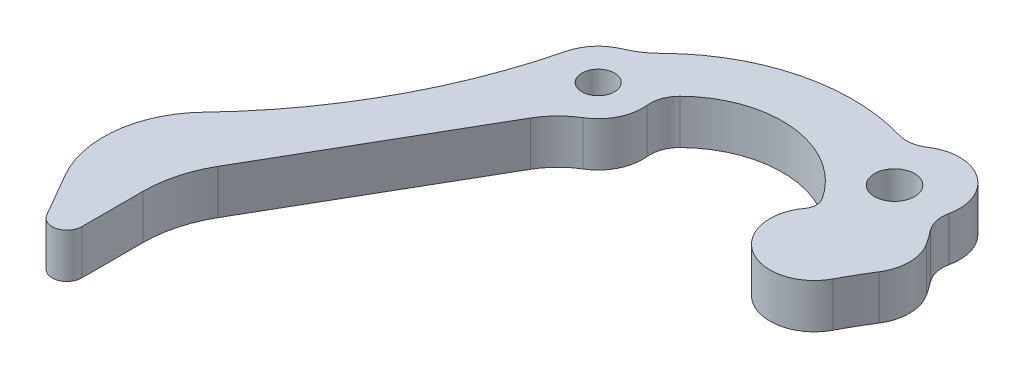
ISO-10303-21;
HEADER;
FILE_DESCRIPTION(('STEP AP214'),'2;1');
FILE_NAME('part.step','',(''),(''),'','','');
FILE_SCHEMA(('AUTOMOTIVE_DESIGN { 1 0 10303 214 1 1 1 1 }'));
ENDSEC;
DATA;
#1=APPLICATION_CONTEXT('core data for automotive mechanical design processes');
#2=APPLICATION_PROTOCOL_DEFINITION('international standard','automotive_design',2000,#1);
#3=PRODUCT_CONTEXT('',#1,'mechanical');
#4=PRODUCT('Part','Part','',(#3));
#5=PRODUCT_RELATED_PRODUCT_CATEGORY('part','',(#4));
#6=PRODUCT_DEFINITION_FORMATION('','',#4);
#7=PRODUCT_DEFINITION_CONTEXT('part definition',#1,'design');
#8=PRODUCT_DEFINITION('design','',#6,#7);
#9=PRODUCT_DEFINITION_SHAPE('','',#8);
#10=(LENGTH_UNIT() NAMED_UNIT(*) SI_UNIT(.MILLI.,.METRE.));
#11=(NAMED_UNIT(*) PLANE_ANGLE_UNIT() SI_UNIT($,.RADIAN.));
#12=(NAMED_UNIT(*) SI_UNIT($,.STERADIAN.) SOLID_ANGLE_UNIT());
#13=UNCERTAINTY_MEASURE_WITH_UNIT(LENGTH_MEASURE(1.E-05),#10,'distance_accuracy_value','');
#14=(GEOMETRIC_REPRESENTATION_CONTEXT(3) GLOBAL_UNCERTAINTY_ASSIGNED_CONTEXT((#13)) GLOBAL_UNIT_ASSIGNED_CONTEXT((#10,
#11,#12)) REPRESENTATION_CONTEXT('',''));
#15=CARTESIAN_POINT('',(0.,0.,0.));
#16=DIRECTION('',(0.,0.,1.));
#17=DIRECTION('',(1.,0.,0.));
#18=AXIS2_PLACEMENT_3D('',#15,#16,#17);
#19=CARTESIAN_POINT('',(9.58333333333333,3.,5.39997427977414));
#20=DIRECTION('',(0.,-1.,0.));
#21=DIRECTION('',(0.,0.,-1.));
#22=AXIS2_PLACEMENT_3D('',#19,#20,#21);
#23=CYLINDRICAL_SURFACE('',#22,13.);
#24=CARTESIAN_POINT('',(9.58333333333333,0.,5.39997427977414));
#25=DIRECTION('',(0.,1.,0.));
#26=DIRECTION('',(0.,0.,1.));
#27=AXIS2_PLACEMENT_3D('',#24,#25,#26);
#28=CIRCLE('',#27,13.);
#29=CARTESIAN_POINT('',(19.8692193431616,0.,-2.54990301442477));
#30=VERTEX_POINT('',#29);
#31=CARTESIAN_POINT('',(20.525,0.,-1.61999228393224));
#32=VERTEX_POINT('',#31);
#33=EDGE_CURVE('E281',#30,#32,#28,.F.);
#34=ORIENTED_EDGE('',*,*,#33,.F.);
#35=DIRECTION('',(0.,-1.,0.));
#36=VECTOR('',#35,1.);
#37=CARTESIAN_POINT('',(19.8692193431616,3.,-2.54990301442477));
#38=LINE('',#37,#36);
#39=CARTESIAN_POINT('',(19.8692193431616,3.,-2.54990301442477));
#40=VERTEX_POINT('',#39);
#41=EDGE_CURVE('E355',#30,#40,#38,.F.);
#42=ORIENTED_EDGE('',*,*,#41,.T.);
#43=CARTESIAN_POINT('',(9.58333333333333,3.,5.39997427977414));
#44=DIRECTION('',(0.,1.,0.));
#45=DIRECTION('',(0.,0.,1.));
#46=AXIS2_PLACEMENT_3D('',#43,#44,#45);
#47=CIRCLE('',#46,13.);
#48=CARTESIAN_POINT('',(20.525,3.,-1.61999228393224));
#49=VERTEX_POINT('',#48);
#50=EDGE_CURVE('E262',#40,#49,#47,.F.);
#51=ORIENTED_EDGE('',*,*,#50,.T.);
#52=DIRECTION('',(0.,-1.,0.));
#53=VECTOR('',#52,1.);
#54=CARTESIAN_POINT('',(20.525,3.,-1.61999228393224));
#55=LINE('',#54,#53);
#56=EDGE_CURVE('E266',#49,#32,#55,.T.);
#57=ORIENTED_EDGE('',*,*,#56,.T.);
#58=EDGE_LOOP('',(#34,#42,#51,#57));
#59=FACE_BOUND('',#58,.T.);
#60=ADVANCED_FACE('F41',(#59),#23,.T.);
#61=CARTESIAN_POINT('',(8.47222222222222,3.,3.03668414842308));
#62=DIRECTION('',(0.,-1.,0.));
#63=DIRECTION('',(0.,0.,-1.));
#64=AXIS2_PLACEMENT_3D('',#61,#62,#63);
#65=CYLINDRICAL_SURFACE('',#64,7.);
#66=CARTESIAN_POINT('',(8.47222222222222,0.,3.03668414842308));
#67=DIRECTION('',(0.,1.,0.));
#68=DIRECTION('',(0.,0.,1.));
#69=AXIS2_PLACEMENT_3D('',#66,#67,#68);
#70=CIRCLE('',#69,7.);
#71=CARTESIAN_POINT('',(3.57117994761107,0.,-1.96129390499756));
#72=VERTEX_POINT('',#71);
#73=CARTESIAN_POINT('',(14.3662242350737,0.,-0.739655385107008));
#74=VERTEX_POINT('',#73);
#75=EDGE_CURVE('E272',#72,#74,#70,.F.);
#76=ORIENTED_EDGE('',*,*,#75,.T.);
#77=DIRECTION('',(0.,-1.,0.));
#78=VECTOR('',#77,1.);
#79=CARTESIAN_POINT('',(14.3662242350737,3.,-0.739655385107009));
#80=LINE('',#79,#78);
#81=CARTESIAN_POINT('',(14.3662242350737,3.,-0.739655385107008));
#82=VERTEX_POINT('',#81);
#83=EDGE_CURVE('E297',#74,#82,#80,.F.);
#84=ORIENTED_EDGE('',*,*,#83,.T.);
#85=CARTESIAN_POINT('',(8.47222222222222,3.,3.03668414842308));
#86=DIRECTION('',(0.,1.,0.));
#87=DIRECTION('',(0.,0.,1.));
#88=AXIS2_PLACEMENT_3D('',#85,#86,#87);
#89=CIRCLE('',#88,7.);
#90=CARTESIAN_POINT('',(3.57117994761107,3.,-1.96129390499756));
#91=VERTEX_POINT('',#90);
#92=EDGE_CURVE('E253',#91,#82,#89,.F.);
#93=ORIENTED_EDGE('',*,*,#92,.F.);
#94=DIRECTION('',(0.,-1.,0.));
#95=VECTOR('',#94,1.);
#96=CARTESIAN_POINT('',(3.57117994761107,3.,-1.96129390499756));
#97=LINE('',#96,#95);
#98=EDGE_CURVE('E294',#91,#72,#97,.T.);
#99=ORIENTED_EDGE('',*,*,#98,.T.);
#100=EDGE_LOOP('',(#76,#84,#93,#99));
#101=FACE_BOUND('',#100,.T.);
#102=ADVANCED_FACE('F394',(#101),#65,.F.);
#103=CARTESIAN_POINT('',(16.75,3.,2.16506350946109));
#104=DIRECTION('',(0.,-1.,0.));
#105=DIRECTION('',(0.,0.,-1.));
#106=AXIS2_PLACEMENT_3D('',#103,#104,#105);
#107=CYLINDRICAL_SURFACE('',#106,3.);
#108=CARTESIAN_POINT('',(16.75,0.,2.16506350946109));
#109=DIRECTION('',(0.,1.,0.));
#110=DIRECTION('',(0.,0.,1.));
#111=AXIS2_PLACEMENT_3D('',#108,#109,#110);
#112=CIRCLE('',#111,3.);
#113=CARTESIAN_POINT('',(14.3306679606426,0.,0.391132145698955));
#114=VERTEX_POINT('',#113);
#115=CARTESIAN_POINT('',(19.4030298609084,0.,3.56557504355433));
#116=VERTEX_POINT('',#115);
#117=EDGE_CURVE('E275',#114,#116,#112,.T.);
#118=ORIENTED_EDGE('',*,*,#117,.T.);
#119=DIRECTION('',(0.,-1.,0.));
#120=VECTOR('',#119,1.);
#121=CARTESIAN_POINT('',(19.4030298609084,3.,3.56557504355433));
#122=LINE('',#121,#120);
#123=CARTESIAN_POINT('',(19.4030298609084,3.,3.56557504355433));
#124=VERTEX_POINT('',#123);
#125=EDGE_CURVE('E292',#116,#124,#122,.F.);
#126=ORIENTED_EDGE('',*,*,#125,.T.);
#127=CARTESIAN_POINT('',(16.75,3.,2.16506350946109));
#128=DIRECTION('',(0.,1.,0.));
#129=DIRECTION('',(0.,0.,1.));
#130=AXIS2_PLACEMENT_3D('',#127,#128,#129);
#131=CIRCLE('',#130,3.);
#132=CARTESIAN_POINT('',(14.3306679606426,3.,0.391132145698955));
#133=VERTEX_POINT('',#132);
#134=EDGE_CURVE('E256',#133,#124,#131,.T.);
#135=ORIENTED_EDGE('',*,*,#134,.F.);
#136=DIRECTION('',(0.,-1.,0.));
#137=VECTOR('',#136,1.);
#138=CARTESIAN_POINT('',(14.3306679606426,3.,0.391132145698955));
#139=LINE('',#138,#137);
#140=EDGE_CURVE('E289',#133,#114,#139,.T.);
#141=ORIENTED_EDGE('',*,*,#140,.T.);
#142=EDGE_LOOP('',(#118,#126,#135,#141));
#143=FACE_BOUND('',#142,.T.);
#144=ADVANCED_FACE('F385',(#143),#107,.T.);
#145=CARTESIAN_POINT('',(18.,3.,0.));
#146=DIRECTION('',(0.,-1.,0.));
#147=DIRECTION('',(0.,0.,-1.));
#148=AXIS2_PLACEMENT_3D('',#145,#146,#147);
#149=CYLINDRICAL_SURFACE('',#148,3.);
#150=CARTESIAN_POINT('',(18.,3.,0.));
#151=DIRECTION('',(0.,1.,0.));
#152=DIRECTION('',(0.,0.,1.));
#153=AXIS2_PLACEMENT_3D('',#150,#151,#152);
#154=CIRCLE('',#153,3.);
#155=CARTESIAN_POINT('',(20.5393934972721,3.,1.59733548949879));
#156=VERTEX_POINT('',#155);
#157=EDGE_CURVE('E259',#156,#49,#154,.T.);
#158=ORIENTED_EDGE('',*,*,#157,.F.);
#159=DIRECTION('',(0.,-1.,0.));
#160=VECTOR('',#159,1.);
#161=CARTESIAN_POINT('',(20.5393934972721,3.,1.59733548949879));
#162=LINE('',#161,#160);
#163=CARTESIAN_POINT('',(20.5393934972721,0.,1.59733548949879));
#164=VERTEX_POINT('',#163);
#165=EDGE_CURVE('E286',#156,#164,#162,.T.);
#166=ORIENTED_EDGE('',*,*,#165,.T.);
#167=CARTESIAN_POINT('',(18.,0.,0.));
#168=DIRECTION('',(0.,1.,0.));
#169=DIRECTION('',(0.,0.,1.));
#170=AXIS2_PLACEMENT_3D('',#167,#168,#169);
#171=CIRCLE('',#170,3.);
#172=EDGE_CURVE('E278',#164,#32,#171,.T.);
#173=ORIENTED_EDGE('',*,*,#172,.T.);
#174=ORIENTED_EDGE('',*,*,#56,.F.);
#175=EDGE_LOOP('',(#158,#166,#173,#174));
#176=FACE_BOUND('',#175,.T.);
#177=ADVANCED_FACE('F377',(#176),#149,.T.);
#178=CARTESIAN_POINT('',(0.,3.,0.));
#179=DIRECTION('',(0.,-1.,0.));
#180=DIRECTION('',(0.,0.,-1.));
#181=AXIS2_PLACEMENT_3D('',#178,#179,#180);
#182=CYLINDRICAL_SURFACE('',#181,1.1);
#183=CARTESIAN_POINT('',(0.,3.,0.));
#184=DIRECTION('',(0.,1.,0.));
#185=DIRECTION('',(0.,0.,1.));
#186=AXIS2_PLACEMENT_3D('',#183,#184,#185);
#187=CIRCLE('',#186,1.1);
#188=CARTESIAN_POINT('',(0.,3.,1.1));
#189=VERTEX_POINT('',#188);
#190=EDGE_CURVE('E249',#189,#189,#187,.T.);
#191=ORIENTED_EDGE('',*,*,#190,.T.);
#192=EDGE_LOOP('',(#191));
#193=FACE_BOUND('',#192,.T.);
#194=CARTESIAN_POINT('',(0.,0.,0.));
#195=DIRECTION('',(0.,1.,0.));
#196=DIRECTION('',(0.,0.,1.));
#197=AXIS2_PLACEMENT_3D('',#194,#195,#196);
#198=CIRCLE('',#197,1.1);
#199=CARTESIAN_POINT('',(0.,0.,1.1));
#200=VERTEX_POINT('',#199);
#201=EDGE_CURVE('E269',#200,#200,#198,.T.);
#202=ORIENTED_EDGE('',*,*,#201,.F.);
#203=EDGE_LOOP('',(#202));
#204=FACE_BOUND('',#203,.T.);
#205=ADVANCED_FACE('F472',(#193,#204),#182,.F.);
#206=CARTESIAN_POINT('',(16.,3.,-4.));
#207=DIRECTION('',(0.,-1.,0.));
#208=DIRECTION('',(0.,0.,-1.));
#209=AXIS2_PLACEMENT_3D('',#206,#207,#208);
#210=CYLINDRICAL_SURFACE('',#209,1.35);
#211=CARTESIAN_POINT('',(16.,3.,-4.));
#212=DIRECTION('',(0.,1.,0.));
#213=DIRECTION('',(0.,0.,1.));
#214=AXIS2_PLACEMENT_3D('',#211,#212,#213);
#215=CIRCLE('',#214,1.35);
#216=CARTESIAN_POINT('',(16.,3.,-2.65));
#217=VERTEX_POINT('',#216);
#218=EDGE_CURVE('E246',#217,#217,#215,.T.);
#219=ORIENTED_EDGE('',*,*,#218,.T.);
#220=EDGE_LOOP('',(#219));
#221=FACE_BOUND('',#220,.T.);
#222=CARTESIAN_POINT('',(16.,0.,-4.));
#223=DIRECTION('',(0.,1.,0.));
#224=DIRECTION('',(0.,0.,1.));
#225=AXIS2_PLACEMENT_3D('',#222,#223,#224);
#226=CIRCLE('',#225,1.35);
#227=CARTESIAN_POINT('',(16.,0.,-2.65));
#228=VERTEX_POINT('',#227);
#229=EDGE_CURVE('E244',#228,#228,#226,.T.);
#230=ORIENTED_EDGE('',*,*,#229,.F.);
#231=EDGE_LOOP('',(#230));
#232=FACE_BOUND('',#231,.T.);
#233=ADVANCED_FACE('F466',(#221,#232),#210,.F.);
#234=CARTESIAN_POINT('',(0.426397690147714,3.,-3.82773018160502));
#235=VERTEX_POINT('',#234);
#236=CARTESIAN_POINT('',(13.2400714875913,3.,-7.07513157433364));
#237=VERTEX_POINT('',#236);
#238=EDGE_CURVE('E263',#235,#237,#47,.F.);
#239=ORIENTED_EDGE('',*,*,#238,.T.);
#240=DIRECTION('',(0.,-1.,0.));
#241=VECTOR('',#240,1.);
#242=CARTESIAN_POINT('',(13.2400714875913,3.,-7.07513157433364));
#243=LINE('',#242,#241);
#244=CARTESIAN_POINT('',(13.2400714875913,0.,-7.07513157433364));
#245=VERTEX_POINT('',#244);
#246=EDGE_CURVE('E353',#237,#245,#243,.T.);
#247=ORIENTED_EDGE('',*,*,#246,.T.);
#248=CARTESIAN_POINT('',(0.426397690147714,0.,-3.82773018160502));
#249=VERTEX_POINT('',#248);
#250=EDGE_CURVE('E250',#249,#245,#28,.F.);
#251=ORIENTED_EDGE('',*,*,#250,.F.);
#252=DIRECTION('',(0.,-1.,0.));
#253=VECTOR('',#252,1.);
#254=CARTESIAN_POINT('',(0.426397690147712,3.,-3.82773018160502));
#255=LINE('',#254,#253);
#256=EDGE_CURVE('E307',#249,#235,#255,.F.);
#257=ORIENTED_EDGE('',*,*,#256,.T.);
#258=EDGE_LOOP('',(#239,#247,#251,#257));
#259=FACE_BOUND('',#258,.T.);
#260=ADVANCED_FACE('F441',(#259),#23,.T.);
#261=CARTESIAN_POINT('',(0.,3.,0.));
#262=DIRECTION('',(0.,1.,0.));
#263=DIRECTION('',(0.,0.,1.));
#264=AXIS2_PLACEMENT_3D('',#261,#262,#263);
#265=PLANE('',#264);
#266=DIRECTION('',(0.499999999999994,0.,0.866025403784442));
#267=VECTOR('',#266,1.);
#268=CARTESIAN_POINT('',(-12.5788030628724,3.,23.3897885329419));
#269=LINE('',#268,#267);
#270=CARTESIAN_POINT('',(-12.5788030628724,3.,23.3897885329419));
#271=VERTEX_POINT('',#270);
#272=CARTESIAN_POINT('',(-10.8660254037846,3.,26.356406460551));
#273=VERTEX_POINT('',#272);
#274=EDGE_CURVE('E238',#271,#273,#269,.T.);
#275=ORIENTED_EDGE('',*,*,#274,.T.);
#276=CARTESIAN_POINT('',(-10.0000000000001,3.,25.856406460551));
#277=DIRECTION('',(0.,1.,0.));
#278=DIRECTION('',(0.,0.,1.));
#279=AXIS2_PLACEMENT_3D('',#276,#277,#278);
#280=CIRCLE('',#279,1.);
#281=CARTESIAN_POINT('',(-9.00000000000011,3.,25.856406460551));
#282=VERTEX_POINT('',#281);
#283=EDGE_CURVE('E333',#273,#282,#280,.T.);
#284=ORIENTED_EDGE('',*,*,#283,.T.);
#285=DIRECTION('',(0.,0.,-1.));
#286=VECTOR('',#285,1.);
#287=CARTESIAN_POINT('',(-9.00000000000011,3.,29.5884572681199));
#288=LINE('',#287,#286);
#289=CARTESIAN_POINT('',(-9.00000000000011,3.,21.7320508075689));
#290=VERTEX_POINT('',#289);
#291=EDGE_CURVE('E225',#282,#290,#288,.T.);
#292=ORIENTED_EDGE('',*,*,#291,.T.);
#293=CARTESIAN_POINT('',(-1.00000000000011,3.,21.7320508075689));
#294=DIRECTION('',(0.,1.,0.));
#295=DIRECTION('',(0.,0.,1.));
#296=AXIS2_PLACEMENT_3D('',#293,#294,#295);
#297=CIRCLE('',#296,8.);
#298=CARTESIAN_POINT('',(-7.9282032302756,3.,17.7320508075689));
#299=VERTEX_POINT('',#298);
#300=EDGE_CURVE('E344',#290,#299,#297,.F.);
#301=ORIENTED_EDGE('',*,*,#300,.T.);
#302=DIRECTION('',(0.500000000000004,0.,-0.866025403784436));
#303=VECTOR('',#302,1.);
#304=CARTESIAN_POINT('',(0.614016818818969,3.,2.93649167310371));
#305=LINE('',#304,#303);
#306=CARTESIAN_POINT('',(-0.204440865534852,3.,4.35410196624969));
#307=VERTEX_POINT('',#306);
#308=EDGE_CURVE('E228',#299,#307,#305,.T.);
#309=ORIENTED_EDGE('',*,*,#308,.T.);
#310=CARTESIAN_POINT('',(4.12568615338733,3.,6.8541019662497));
#311=DIRECTION('',(0.,1.,0.));
#312=DIRECTION('',(0.,0.,1.));
#313=AXIS2_PLACEMENT_3D('',#310,#311,#312);
#314=CIRCLE('',#313,5.);
#315=CARTESIAN_POINT('',(1.54713230752025,3.,2.57028823734364));
#316=VERTEX_POINT('',#315);
#317=EDGE_CURVE('E321',#307,#316,#314,.F.);
#318=ORIENTED_EDGE('',*,*,#317,.T.);
#319=CARTESIAN_POINT('',(0.,3.,0.));
#320=DIRECTION('',(0.,1.,0.));
#321=DIRECTION('',(0.,0.,1.));
#322=AXIS2_PLACEMENT_3D('',#319,#320,#321);
#323=CIRCLE('',#322,3.);
#324=CARTESIAN_POINT('',(2.98288664421427,3.,-0.319980105269283));
#325=VERTEX_POINT('',#324);
#326=EDGE_CURVE('E233',#316,#325,#323,.T.);
#327=ORIENTED_EDGE('',*,*,#326,.T.);
#328=CARTESIAN_POINT('',(4.97147774035711,3.,-0.533300175448805));
#329=DIRECTION('',(0.,1.,0.));
#330=DIRECTION('',(0.,0.,1.));
#331=AXIS2_PLACEMENT_3D('',#328,#329,#330);
#332=CIRCLE('',#331,2.);
#333=EDGE_CURVE('E319',#325,#91,#332,.F.);
#334=ORIENTED_EDGE('',*,*,#333,.T.);
#335=ORIENTED_EDGE('',*,*,#92,.T.);
#336=CARTESIAN_POINT('',(13.5242239475235,3.,-0.200178308888424));
#337=DIRECTION('',(0.,1.,0.));
#338=DIRECTION('',(0.,0.,1.));
#339=AXIS2_PLACEMENT_3D('',#336,#337,#338);
#340=CIRCLE('',#339,1.);
#341=EDGE_CURVE('E315',#82,#133,#340,.F.);
#342=ORIENTED_EDGE('',*,*,#341,.T.);
#343=ORIENTED_EDGE('',*,*,#134,.T.);
#344=CARTESIAN_POINT('',(45.9333284699927,3.,17.5706903844867));
#345=DIRECTION('',(0.,1.,0.));
#346=DIRECTION('',(0.,0.,1.));
#347=AXIS2_PLACEMENT_3D('',#344,#345,#346);
#348=CIRCLE('',#347,30.);
#349=EDGE_CURVE('E311',#124,#156,#348,.F.);
#350=ORIENTED_EDGE('',*,*,#349,.T.);
#351=ORIENTED_EDGE('',*,*,#157,.T.);
#352=ORIENTED_EDGE('',*,*,#50,.F.);
#353=CARTESIAN_POINT('',(21.4516633446736,3.,-3.77296105968614));
#354=DIRECTION('',(0.,1.,0.));
#355=DIRECTION('',(0.,0.,1.));
#356=AXIS2_PLACEMENT_3D('',#353,#354,#355);
#357=CIRCLE('',#356,2.);
#358=CARTESIAN_POINT('',(19.4965148816765,3.,-4.1941433095968));
#359=VERTEX_POINT('',#358);
#360=EDGE_CURVE('E49',#40,#359,#357,.F.);
#361=ORIENTED_EDGE('',*,*,#360,.T.);
#362=CARTESIAN_POINT('',(16.5637921871807,3.,-4.82591668446279));
#363=DIRECTION('',(0.,1.,0.));
#364=DIRECTION('',(0.,0.,1.));
#365=AXIS2_PLACEMENT_3D('',#362,#363,#364);
#366=CIRCLE('',#365,3.);
#367=CARTESIAN_POINT('',(14.9071048278201,3.,-7.32699385107217));
#368=VERTEX_POINT('',#367);
#369=EDGE_CURVE('E366',#359,#368,#366,.T.);
#370=ORIENTED_EDGE('',*,*,#369,.T.);
#371=CARTESIAN_POINT('',(13.8026465882464,3.,-8.99437862881175));
#372=DIRECTION('',(0.,1.,0.));
#373=DIRECTION('',(0.,0.,1.));
#374=AXIS2_PLACEMENT_3D('',#371,#372,#373);
#375=CIRCLE('',#374,2.);
#376=EDGE_CURVE('E357',#368,#237,#375,.F.);
#377=ORIENTED_EDGE('',*,*,#376,.T.);
#378=ORIENTED_EDGE('',*,*,#238,.F.);
#379=CARTESIAN_POINT('',(-3.09550063415445,3.,-7.37684728213547));
#380=DIRECTION('',(0.,1.,0.));
#381=DIRECTION('',(0.,0.,1.));
#382=AXIS2_PLACEMENT_3D('',#379,#380,#381);
#383=CIRCLE('',#382,5.);
#384=CARTESIAN_POINT('',(-1.16081273780792,3.,-2.7663177308008));
#385=VERTEX_POINT('',#384);
#386=EDGE_CURVE('E328',#235,#385,#383,.F.);
#387=ORIENTED_EDGE('',*,*,#386,.T.);
#388=CARTESIAN_POINT('',(-2.91235108629063,3.,-0.719868842346832));
#389=VERTEX_POINT('',#388);
#390=EDGE_CURVE('E231',#385,#389,#323,.T.);
#391=ORIENTED_EDGE('',*,*,#390,.T.);
#392=CARTESIAN_POINT('',(-36.889780426348,3.,-9.11833866972653));
#393=DIRECTION('',(0.,-1.,0.));
#394=DIRECTION('',(0.,0.,-1.));
#395=AXIS2_PLACEMENT_3D('',#392,#393,#394);
#396=CIRCLE('',#395,35.);
#397=CARTESIAN_POINT('',(-11.5788177680424,3.,15.0551006658306));
#398=VERTEX_POINT('',#397);
#399=EDGE_CURVE('E207',#389,#398,#396,.T.);
#400=ORIENTED_EDGE('',*,*,#399,.T.);
#401=CARTESIAN_POINT('',(-6.51662523638128,3.,19.889788532942));
#402=DIRECTION('',(0.,1.,0.));
#403=DIRECTION('',(0.,0.,1.));
#404=AXIS2_PLACEMENT_3D('',#401,#402,#403);
#405=CIRCLE('',#404,7.);
#406=EDGE_CURVE('E235',#398,#271,#405,.T.);
#407=ORIENTED_EDGE('',*,*,#406,.T.);
#408=EDGE_LOOP('',(#275,#284,#292,#301,#309,#318,#327,#334,#335,#342,#343,#350,#351,#352,#361,
#370,#377,#378,#387,#391,#400,#407));
#409=FACE_BOUND('',#408,.T.);
#410=ORIENTED_EDGE('',*,*,#218,.F.);
#411=EDGE_LOOP('',(#410));
#412=FACE_BOUND('',#411,.T.);
#413=ORIENTED_EDGE('',*,*,#190,.F.);
#414=EDGE_LOOP('',(#413));
#415=FACE_BOUND('',#414,.T.);
#416=ADVANCED_FACE('F364',(#409,#412,#415),#265,.T.);
#417=CARTESIAN_POINT('',(0.,0.,0.));
#418=DIRECTION('',(0.,1.,0.));
#419=DIRECTION('',(0.,0.,1.));
#420=AXIS2_PLACEMENT_3D('',#417,#418,#419);
#421=PLANE('',#420);
#422=DIRECTION('',(0.,0.,-1.));
#423=VECTOR('',#422,1.);
#424=CARTESIAN_POINT('',(-9.00000000000011,0.,29.5884572681199));
#425=LINE('',#424,#423);
#426=CARTESIAN_POINT('',(-9.00000000000011,0.,25.856406460551));
#427=VERTEX_POINT('',#426);
#428=CARTESIAN_POINT('',(-9.00000000000011,0.,21.7320508075689));
#429=VERTEX_POINT('',#428);
#430=EDGE_CURVE('E241',#427,#429,#425,.T.);
#431=ORIENTED_EDGE('',*,*,#430,.F.);
#432=CARTESIAN_POINT('',(-10.0000000000001,0.,25.856406460551));
#433=DIRECTION('',(0.,1.,0.));
#434=DIRECTION('',(0.,0.,1.));
#435=AXIS2_PLACEMENT_3D('',#432,#433,#434);
#436=CIRCLE('',#435,1.);
#437=CARTESIAN_POINT('',(-10.8660254037846,0.,26.356406460551));
#438=VERTEX_POINT('',#437);
#439=EDGE_CURVE('E340',#427,#438,#436,.F.);
#440=ORIENTED_EDGE('',*,*,#439,.T.);
#441=DIRECTION('',(0.499999999999994,0.,0.866025403784442));
#442=VECTOR('',#441,1.);
#443=CARTESIAN_POINT('',(-12.5788030628724,0.,23.3897885329419));
#444=LINE('',#443,#442);
#445=CARTESIAN_POINT('',(-12.5788030628724,0.,23.3897885329419));
#446=VERTEX_POINT('',#445);
#447=EDGE_CURVE('E209',#446,#438,#444,.T.);
#448=ORIENTED_EDGE('',*,*,#447,.F.);
#449=CARTESIAN_POINT('',(-6.51662523638128,0.,19.889788532942));
#450=DIRECTION('',(0.,1.,0.));
#451=DIRECTION('',(0.,0.,1.));
#452=AXIS2_PLACEMENT_3D('',#449,#450,#451);
#453=CIRCLE('',#452,7.);
#454=CARTESIAN_POINT('',(-11.5788177680424,0.,15.0551006658306));
#455=VERTEX_POINT('',#454);
#456=EDGE_CURVE('E217',#455,#446,#453,.T.);
#457=ORIENTED_EDGE('',*,*,#456,.F.);
#458=CARTESIAN_POINT('',(-36.889780426348,0.,-9.11833866972653));
#459=DIRECTION('',(0.,-1.,0.));
#460=DIRECTION('',(0.,0.,-1.));
#461=AXIS2_PLACEMENT_3D('',#458,#459,#460);
#462=CIRCLE('',#461,35.);
#463=CARTESIAN_POINT('',(-2.91235108629063,0.,-0.719868842346832));
#464=VERTEX_POINT('',#463);
#465=EDGE_CURVE('E205',#464,#455,#462,.T.);
#466=ORIENTED_EDGE('',*,*,#465,.F.);
#467=CARTESIAN_POINT('',(0.,0.,0.));
#468=DIRECTION('',(0.,1.,0.));
#469=DIRECTION('',(0.,0.,1.));
#470=AXIS2_PLACEMENT_3D('',#467,#468,#469);
#471=CIRCLE('',#470,3.);
#472=CARTESIAN_POINT('',(-1.16081273780792,0.,-2.7663177308008));
#473=VERTEX_POINT('',#472);
#474=EDGE_CURVE('E190',#473,#464,#471,.T.);
#475=ORIENTED_EDGE('',*,*,#474,.F.);
#476=CARTESIAN_POINT('',(-3.09550063415445,0.,-7.37684728213547));
#477=DIRECTION('',(0.,1.,0.));
#478=DIRECTION('',(0.,0.,1.));
#479=AXIS2_PLACEMENT_3D('',#476,#477,#478);
#480=CIRCLE('',#479,5.);
#481=EDGE_CURVE('E326',#473,#249,#480,.T.);
#482=ORIENTED_EDGE('',*,*,#481,.T.);
#483=ORIENTED_EDGE('',*,*,#250,.T.);
#484=CARTESIAN_POINT('',(13.8026465882464,0.,-8.99437862881175));
#485=DIRECTION('',(0.,1.,0.));
#486=DIRECTION('',(0.,0.,1.));
#487=AXIS2_PLACEMENT_3D('',#484,#485,#486);
#488=CIRCLE('',#487,2.);
#489=CARTESIAN_POINT('',(14.9071048278201,0.,-7.32699385107217));
#490=VERTEX_POINT('',#489);
#491=EDGE_CURVE('E359',#245,#490,#488,.T.);
#492=ORIENTED_EDGE('',*,*,#491,.T.);
#493=CARTESIAN_POINT('',(16.5637921871807,0.,-4.82591668446279));
#494=DIRECTION('',(0.,1.,0.));
#495=DIRECTION('',(0.,0.,1.));
#496=AXIS2_PLACEMENT_3D('',#493,#494,#495);
#497=CIRCLE('',#496,3.);
#498=CARTESIAN_POINT('',(19.4965148816765,0.,-4.1941433095968));
#499=VERTEX_POINT('',#498);
#500=EDGE_CURVE('E229',#490,#499,#497,.F.);
#501=ORIENTED_EDGE('',*,*,#500,.T.);
#502=CARTESIAN_POINT('',(21.4516633446736,0.,-3.77296105968614));
#503=DIRECTION('',(0.,1.,0.));
#504=DIRECTION('',(0.,0.,1.));
#505=AXIS2_PLACEMENT_3D('',#502,#503,#504);
#506=CIRCLE('',#505,2.);
#507=EDGE_CURVE('E12',#499,#30,#506,.T.);
#508=ORIENTED_EDGE('',*,*,#507,.T.);
#509=ORIENTED_EDGE('',*,*,#33,.T.);
#510=ORIENTED_EDGE('',*,*,#172,.F.);
#511=CARTESIAN_POINT('',(45.9333284699927,0.,17.5706903844867));
#512=DIRECTION('',(0.,1.,0.));
#513=DIRECTION('',(0.,0.,1.));
#514=AXIS2_PLACEMENT_3D('',#511,#512,#513);
#515=CIRCLE('',#514,30.);
#516=EDGE_CURVE('E309',#164,#116,#515,.T.);
#517=ORIENTED_EDGE('',*,*,#516,.T.);
#518=ORIENTED_EDGE('',*,*,#117,.F.);
#519=CARTESIAN_POINT('',(13.5242239475235,0.,-0.200178308888424));
#520=DIRECTION('',(0.,1.,0.));
#521=DIRECTION('',(0.,0.,1.));
#522=AXIS2_PLACEMENT_3D('',#519,#520,#521);
#523=CIRCLE('',#522,1.);
#524=EDGE_CURVE('E313',#114,#74,#523,.T.);
#525=ORIENTED_EDGE('',*,*,#524,.T.);
#526=ORIENTED_EDGE('',*,*,#75,.F.);
#527=CARTESIAN_POINT('',(4.97147774035711,0.,-0.533300175448805));
#528=DIRECTION('',(0.,1.,0.));
#529=DIRECTION('',(0.,0.,1.));
#530=AXIS2_PLACEMENT_3D('',#527,#528,#529);
#531=CIRCLE('',#530,2.);
#532=CARTESIAN_POINT('',(2.98288664421427,0.,-0.319980105269283));
#533=VERTEX_POINT('',#532);
#534=EDGE_CURVE('E317',#72,#533,#531,.T.);
#535=ORIENTED_EDGE('',*,*,#534,.T.);
#536=CARTESIAN_POINT('',(1.54713230752025,0.,2.57028823734364));
#537=VERTEX_POINT('',#536);
#538=EDGE_CURVE('E199',#537,#533,#471,.T.);
#539=ORIENTED_EDGE('',*,*,#538,.F.);
#540=CARTESIAN_POINT('',(4.12568615338733,0.,6.8541019662497));
#541=DIRECTION('',(0.,1.,0.));
#542=DIRECTION('',(0.,0.,1.));
#543=AXIS2_PLACEMENT_3D('',#540,#541,#542);
#544=CIRCLE('',#543,5.);
#545=CARTESIAN_POINT('',(-0.204440865534852,0.,4.35410196624969));
#546=VERTEX_POINT('',#545);
#547=EDGE_CURVE('E323',#537,#546,#544,.T.);
#548=ORIENTED_EDGE('',*,*,#547,.T.);
#549=DIRECTION('',(0.500000000000004,0.,-0.866025403784436));
#550=VECTOR('',#549,1.);
#551=CARTESIAN_POINT('',(0.614016818818969,0.,2.93649167310371));
#552=LINE('',#551,#550);
#553=CARTESIAN_POINT('',(-7.9282032302756,0.,17.7320508075689));
#554=VERTEX_POINT('',#553);
#555=EDGE_CURVE('E200',#554,#546,#552,.T.);
#556=ORIENTED_EDGE('',*,*,#555,.F.);
#557=CARTESIAN_POINT('',(-1.00000000000011,0.,21.7320508075689));
#558=DIRECTION('',(0.,1.,0.));
#559=DIRECTION('',(0.,0.,1.));
#560=AXIS2_PLACEMENT_3D('',#557,#558,#559);
#561=CIRCLE('',#560,8.);
#562=EDGE_CURVE('E346',#554,#429,#561,.T.);
#563=ORIENTED_EDGE('',*,*,#562,.T.);
#564=EDGE_LOOP('',(#431,#440,#448,#457,#466,#475,#482,#483,#492,#501,#508,#509,#510,#517,#518,
#525,#526,#535,#539,#548,#556,#563));
#565=FACE_BOUND('',#564,.T.);
#566=ORIENTED_EDGE('',*,*,#229,.T.);
#567=EDGE_LOOP('',(#566));
#568=FACE_BOUND('',#567,.T.);
#569=ORIENTED_EDGE('',*,*,#201,.T.);
#570=EDGE_LOOP('',(#569));
#571=FACE_BOUND('',#570,.T.);
#572=ADVANCED_FACE('F213',(#565,#568,#571),#421,.F.);
#573=CARTESIAN_POINT('',(0.,0.,0.));
#574=DIRECTION('',(0.,1.,0.));
#575=DIRECTION('',(0.,0.,1.));
#576=AXIS2_PLACEMENT_3D('',#573,#574,#575);
#577=CYLINDRICAL_SURFACE('',#576,3.);
#578=ORIENTED_EDGE('',*,*,#538,.T.);
#579=DIRECTION('',(0.,1.,0.));
#580=VECTOR('',#579,1.);
#581=CARTESIAN_POINT('',(2.98288664421427,0.,-0.319980105269283));
#582=LINE('',#581,#580);
#583=EDGE_CURVE('E301',#533,#325,#582,.T.);
#584=ORIENTED_EDGE('',*,*,#583,.T.);
#585=ORIENTED_EDGE('',*,*,#326,.F.);
#586=DIRECTION('',(0.,1.,0.));
#587=VECTOR('',#586,1.);
#588=CARTESIAN_POINT('',(1.54713230752025,0.,2.57028823734364));
#589=LINE('',#588,#587);
#590=EDGE_CURVE('E299',#316,#537,#589,.F.);
#591=ORIENTED_EDGE('',*,*,#590,.T.);
#592=EDGE_LOOP('',(#578,#584,#585,#591));
#593=FACE_BOUND('',#592,.T.);
#594=ADVANCED_FACE('F404',(#593),#577,.T.);
#595=CARTESIAN_POINT('',(-9.00000000000011,0.,29.5884572681199));
#596=DIRECTION('',(1.,0.,0.));
#597=DIRECTION('',(0.,0.,-1.));
#598=AXIS2_PLACEMENT_3D('',#595,#596,#597);
#599=PLANE('',#598);
#600=ORIENTED_EDGE('',*,*,#291,.F.);
#601=DIRECTION('',(0.,1.,0.));
#602=VECTOR('',#601,1.);
#603=CARTESIAN_POINT('',(-9.00000000000011,0.,25.856406460551));
#604=LINE('',#603,#602);
#605=EDGE_CURVE('E338',#282,#427,#604,.F.);
#606=ORIENTED_EDGE('',*,*,#605,.T.);
#607=ORIENTED_EDGE('',*,*,#430,.T.);
#608=DIRECTION('',(0.,1.,0.));
#609=VECTOR('',#608,1.);
#610=CARTESIAN_POINT('',(-9.00000000000011,3.,21.7320508075689));
#611=LINE('',#610,#609);
#612=EDGE_CURVE('E335',#429,#290,#611,.T.);
#613=ORIENTED_EDGE('',*,*,#612,.T.);
#614=EDGE_LOOP('',(#600,#606,#607,#613));
#615=FACE_BOUND('',#614,.T.);
#616=ADVANCED_FACE('F422',(#615),#599,.T.);
#617=CARTESIAN_POINT('',(-12.5788030628724,0.,23.3897885329419));
#618=DIRECTION('',(-0.866025403784442,0.,0.499999999999994));
#619=DIRECTION('',(0.499999999999994,0.,0.866025403784442));
#620=AXIS2_PLACEMENT_3D('',#617,#618,#619);
#621=PLANE('',#620);
#622=ORIENTED_EDGE('',*,*,#447,.T.);
#623=DIRECTION('',(0.,1.,0.));
#624=VECTOR('',#623,1.);
#625=CARTESIAN_POINT('',(-10.8660254037846,0.,26.356406460551));
#626=LINE('',#625,#624);
#627=EDGE_CURVE('E330',#438,#273,#626,.T.);
#628=ORIENTED_EDGE('',*,*,#627,.T.);
#629=ORIENTED_EDGE('',*,*,#274,.F.);
#630=DIRECTION('',(0.,1.,0.));
#631=VECTOR('',#630,1.);
#632=CARTESIAN_POINT('',(-12.5788030628724,0.,23.3897885329419));
#633=LINE('',#632,#631);
#634=EDGE_CURVE('E242',#446,#271,#633,.T.);
#635=ORIENTED_EDGE('',*,*,#634,.F.);
#636=EDGE_LOOP('',(#622,#628,#629,#635));
#637=FACE_BOUND('',#636,.T.);
#638=ADVANCED_FACE('F431',(#637),#621,.T.);
#639=CARTESIAN_POINT('',(-6.51662523638128,0.,19.889788532942));
#640=DIRECTION('',(0.,1.,0.));
#641=DIRECTION('',(0.,0.,1.));
#642=AXIS2_PLACEMENT_3D('',#639,#640,#641);
#643=CYLINDRICAL_SURFACE('',#642,7.);
#644=ORIENTED_EDGE('',*,*,#406,.F.);
#645=DIRECTION('',(0.,1.,0.));
#646=VECTOR('',#645,1.);
#647=CARTESIAN_POINT('',(-11.5788177680424,0.,15.0551006658306));
#648=LINE('',#647,#646);
#649=EDGE_CURVE('E208',#455,#398,#648,.T.);
#650=ORIENTED_EDGE('',*,*,#649,.F.);
#651=ORIENTED_EDGE('',*,*,#456,.T.);
#652=ORIENTED_EDGE('',*,*,#634,.T.);
#653=EDGE_LOOP('',(#644,#650,#651,#652));
#654=FACE_BOUND('',#653,.T.);
#655=ADVANCED_FACE('F448',(#654),#643,.T.);
#656=CARTESIAN_POINT('',(-36.889780426348,0.,-9.11833866972653));
#657=DIRECTION('',(0.,1.,0.));
#658=DIRECTION('',(0.,0.,1.));
#659=AXIS2_PLACEMENT_3D('',#656,#657,#658);
#660=CYLINDRICAL_SURFACE('',#659,35.);
#661=ORIENTED_EDGE('',*,*,#399,.F.);
#662=DIRECTION('',(0.,1.,0.));
#663=VECTOR('',#662,1.);
#664=CARTESIAN_POINT('',(-2.91235108629063,0.,-0.719868842346832));
#665=LINE('',#664,#663);
#666=EDGE_CURVE('E194',#464,#389,#665,.T.);
#667=ORIENTED_EDGE('',*,*,#666,.F.);
#668=ORIENTED_EDGE('',*,*,#465,.T.);
#669=ORIENTED_EDGE('',*,*,#649,.T.);
#670=EDGE_LOOP('',(#661,#667,#668,#669));
#671=FACE_BOUND('',#670,.T.);
#672=ADVANCED_FACE('F204',(#671),#660,.F.);
#673=ORIENTED_EDGE('',*,*,#390,.F.);
#674=DIRECTION('',(0.,1.,0.));
#675=VECTOR('',#674,1.);
#676=CARTESIAN_POINT('',(-1.16081273780792,0.,-2.7663177308008));
#677=LINE('',#676,#675);
#678=EDGE_CURVE('E197',#385,#473,#677,.F.);
#679=ORIENTED_EDGE('',*,*,#678,.T.);
#680=ORIENTED_EDGE('',*,*,#474,.T.);
#681=ORIENTED_EDGE('',*,*,#666,.T.);
#682=EDGE_LOOP('',(#673,#679,#680,#681));
#683=FACE_BOUND('',#682,.T.);
#684=ADVANCED_FACE('F193',(#683),#577,.T.);
#685=CARTESIAN_POINT('',(0.614016818818969,0.,2.93649167310371));
#686=DIRECTION('',(0.866025403784436,0.,0.500000000000004));
#687=DIRECTION('',(0.500000000000004,0.,-0.866025403784436));
#688=AXIS2_PLACEMENT_3D('',#685,#686,#687);
#689=PLANE('',#688);
#690=ORIENTED_EDGE('',*,*,#308,.F.);
#691=DIRECTION('',(0.,1.,0.));
#692=VECTOR('',#691,1.);
#693=CARTESIAN_POINT('',(-7.9282032302756,0.,17.7320508075689));
#694=LINE('',#693,#692);
#695=EDGE_CURVE('E342',#299,#554,#694,.F.);
#696=ORIENTED_EDGE('',*,*,#695,.T.);
#697=ORIENTED_EDGE('',*,*,#555,.T.);
#698=DIRECTION('',(0.,-1.,0.));
#699=VECTOR('',#698,1.);
#700=CARTESIAN_POINT('',(-0.204440865534852,3.,4.35410196624968));
#701=LINE('',#700,#699);
#702=EDGE_CURVE('E303',#546,#307,#701,.F.);
#703=ORIENTED_EDGE('',*,*,#702,.T.);
#704=EDGE_LOOP('',(#690,#696,#697,#703));
#705=FACE_BOUND('',#704,.T.);
#706=ADVANCED_FACE('F484',(#705),#689,.T.);
#707=CARTESIAN_POINT('',(45.9333284699927,3.,17.5706903844867));
#708=DIRECTION('',(0.,1.,0.));
#709=DIRECTION('',(0.,0.,1.));
#710=AXIS2_PLACEMENT_3D('',#707,#708,#709);
#711=CYLINDRICAL_SURFACE('',#710,30.);
#712=ORIENTED_EDGE('',*,*,#349,.F.);
#713=ORIENTED_EDGE('',*,*,#125,.F.);
#714=ORIENTED_EDGE('',*,*,#516,.F.);
#715=ORIENTED_EDGE('',*,*,#165,.F.);
#716=EDGE_LOOP('',(#712,#713,#714,#715));
#717=FACE_BOUND('',#716,.T.);
#718=ADVANCED_FACE('F381',(#717),#711,.F.);
#719=CARTESIAN_POINT('',(13.5242239475235,3.,-0.200178308888424));
#720=DIRECTION('',(0.,-1.,0.));
#721=DIRECTION('',(0.,0.,-1.));
#722=AXIS2_PLACEMENT_3D('',#719,#720,#721);
#723=CYLINDRICAL_SURFACE('',#722,1.);
#724=ORIENTED_EDGE('',*,*,#341,.F.);
#725=ORIENTED_EDGE('',*,*,#83,.F.);
#726=ORIENTED_EDGE('',*,*,#524,.F.);
#727=ORIENTED_EDGE('',*,*,#140,.F.);
#728=EDGE_LOOP('',(#724,#725,#726,#727));
#729=FACE_BOUND('',#728,.T.);
#730=ADVANCED_FACE('F390',(#729),#723,.F.);
#731=CARTESIAN_POINT('',(4.97147774035711,0.,-0.533300175448805));
#732=DIRECTION('',(0.,-1.,0.));
#733=DIRECTION('',(0.,0.,-1.));
#734=AXIS2_PLACEMENT_3D('',#731,#732,#733);
#735=CYLINDRICAL_SURFACE('',#734,2.);
#736=ORIENTED_EDGE('',*,*,#333,.F.);
#737=ORIENTED_EDGE('',*,*,#583,.F.);
#738=ORIENTED_EDGE('',*,*,#534,.F.);
#739=ORIENTED_EDGE('',*,*,#98,.F.);
#740=EDGE_LOOP('',(#736,#737,#738,#739));
#741=FACE_BOUND('',#740,.T.);
#742=ADVANCED_FACE('F399',(#741),#735,.F.);
#743=CARTESIAN_POINT('',(4.12568615338733,0.,6.8541019662497));
#744=DIRECTION('',(0.,1.,0.));
#745=DIRECTION('',(0.,0.,1.));
#746=AXIS2_PLACEMENT_3D('',#743,#744,#745);
#747=CYLINDRICAL_SURFACE('',#746,5.);
#748=ORIENTED_EDGE('',*,*,#547,.F.);
#749=ORIENTED_EDGE('',*,*,#590,.F.);
#750=ORIENTED_EDGE('',*,*,#317,.F.);
#751=ORIENTED_EDGE('',*,*,#702,.F.);
#752=EDGE_LOOP('',(#748,#749,#750,#751));
#753=FACE_BOUND('',#752,.T.);
#754=ADVANCED_FACE('F410',(#753),#747,.F.);
#755=CARTESIAN_POINT('',(-3.09550063415445,3.,-7.37684728213547));
#756=DIRECTION('',(0.,1.,0.));
#757=DIRECTION('',(0.,0.,1.));
#758=AXIS2_PLACEMENT_3D('',#755,#756,#757);
#759=CYLINDRICAL_SURFACE('',#758,5.);
#760=ORIENTED_EDGE('',*,*,#386,.F.);
#761=ORIENTED_EDGE('',*,*,#256,.F.);
#762=ORIENTED_EDGE('',*,*,#481,.F.);
#763=ORIENTED_EDGE('',*,*,#678,.F.);
#764=EDGE_LOOP('',(#760,#761,#762,#763));
#765=FACE_BOUND('',#764,.T.);
#766=ADVANCED_FACE('F445',(#765),#759,.F.);
#767=CARTESIAN_POINT('',(-10.0000000000001,0.,25.856406460551));
#768=DIRECTION('',(0.,1.,0.));
#769=DIRECTION('',(0.,0.,1.));
#770=AXIS2_PLACEMENT_3D('',#767,#768,#769);
#771=CYLINDRICAL_SURFACE('',#770,1.);
#772=ORIENTED_EDGE('',*,*,#439,.F.);
#773=ORIENTED_EDGE('',*,*,#605,.F.);
#774=ORIENTED_EDGE('',*,*,#283,.F.);
#775=ORIENTED_EDGE('',*,*,#627,.F.);
#776=EDGE_LOOP('',(#772,#773,#774,#775));
#777=FACE_BOUND('',#776,.T.);
#778=ADVANCED_FACE('F429',(#777),#771,.T.);
#779=CARTESIAN_POINT('',(-1.00000000000011,0.,21.7320508075689));
#780=DIRECTION('',(0.,-1.,0.));
#781=DIRECTION('',(0.,0.,-1.));
#782=AXIS2_PLACEMENT_3D('',#779,#780,#781);
#783=CYLINDRICAL_SURFACE('',#782,8.);
#784=ORIENTED_EDGE('',*,*,#562,.F.);
#785=ORIENTED_EDGE('',*,*,#695,.F.);
#786=ORIENTED_EDGE('',*,*,#300,.F.);
#787=ORIENTED_EDGE('',*,*,#612,.F.);
#788=EDGE_LOOP('',(#784,#785,#786,#787));
#789=FACE_BOUND('',#788,.T.);
#790=ADVANCED_FACE('F419',(#789),#783,.F.);
#791=CARTESIAN_POINT('',(16.5637921871807,-6.93890842292127,-4.82591668446279));
#792=DIRECTION('',(0.,1.,0.));
#793=DIRECTION('',(0.,0.,1.));
#794=AXIS2_PLACEMENT_3D('',#791,#792,#793);
#795=CYLINDRICAL_SURFACE('',#794,3.);
#796=ORIENTED_EDGE('',*,*,#500,.F.);
#797=DIRECTION('',(0.,1.,0.));
#798=VECTOR('',#797,1.);
#799=CARTESIAN_POINT('',(14.9071048278201,-6.93890842292127,-7.32699385107217));
#800=LINE('',#799,#798);
#801=EDGE_CURVE('E350',#490,#368,#800,.T.);
#802=ORIENTED_EDGE('',*,*,#801,.T.);
#803=ORIENTED_EDGE('',*,*,#369,.F.);
#804=DIRECTION('',(0.,1.,0.));
#805=VECTOR('',#804,1.);
#806=CARTESIAN_POINT('',(19.4965148816765,-6.93890842292127,-4.1941433095968));
#807=LINE('',#806,#805);
#808=EDGE_CURVE('E348',#359,#499,#807,.F.);
#809=ORIENTED_EDGE('',*,*,#808,.T.);
#810=EDGE_LOOP('',(#796,#802,#803,#809));
#811=FACE_BOUND('',#810,.T.);
#812=ADVANCED_FACE('F369',(#811),#795,.T.);
#813=CARTESIAN_POINT('',(13.8026465882464,3.,-8.99437862881175));
#814=DIRECTION('',(0.,-1.,0.));
#815=DIRECTION('',(0.,0.,-1.));
#816=AXIS2_PLACEMENT_3D('',#813,#814,#815);
#817=CYLINDRICAL_SURFACE('',#816,2.);
#818=ORIENTED_EDGE('',*,*,#491,.F.);
#819=ORIENTED_EDGE('',*,*,#246,.F.);
#820=ORIENTED_EDGE('',*,*,#376,.F.);
#821=ORIENTED_EDGE('',*,*,#801,.F.);
#822=EDGE_LOOP('',(#818,#819,#820,#821));
#823=FACE_BOUND('',#822,.T.);
#824=ADVANCED_FACE('F436',(#823),#817,.F.);
#825=CARTESIAN_POINT('',(21.4516633446736,-6.93890842292127,-3.77296105968614));
#826=DIRECTION('',(0.,-1.,0.));
#827=DIRECTION('',(0.,0.,-1.));
#828=AXIS2_PLACEMENT_3D('',#825,#826,#827);
#829=CYLINDRICAL_SURFACE('',#828,2.);
#830=ORIENTED_EDGE('',*,*,#507,.F.);
#831=ORIENTED_EDGE('',*,*,#808,.F.);
#832=ORIENTED_EDGE('',*,*,#360,.F.);
#833=ORIENTED_EDGE('',*,*,#41,.F.);
#834=EDGE_LOOP('',(#830,#831,#832,#833));
#835=FACE_BOUND('',#834,.T.);
#836=ADVANCED_FACE('F43',(#835),#829,.F.);
#837=CLOSED_SHELL('',(#60,#102,#144,#177,#205,#233,#260,#416,#572,#594,#616,#638,#655,#672,#684,
#706,#718,#730,#742,#754,#766,#778,#790,#812,#824,#836));
#838=MANIFOLD_SOLID_BREP('B2',#837);
#839=ADVANCED_BREP_SHAPE_REPRESENTATION('',(#18,#838),#14);
#840=SHAPE_DEFINITION_REPRESENTATION(#9,#839);
ENDSEC;
END-ISO-10303-21;
